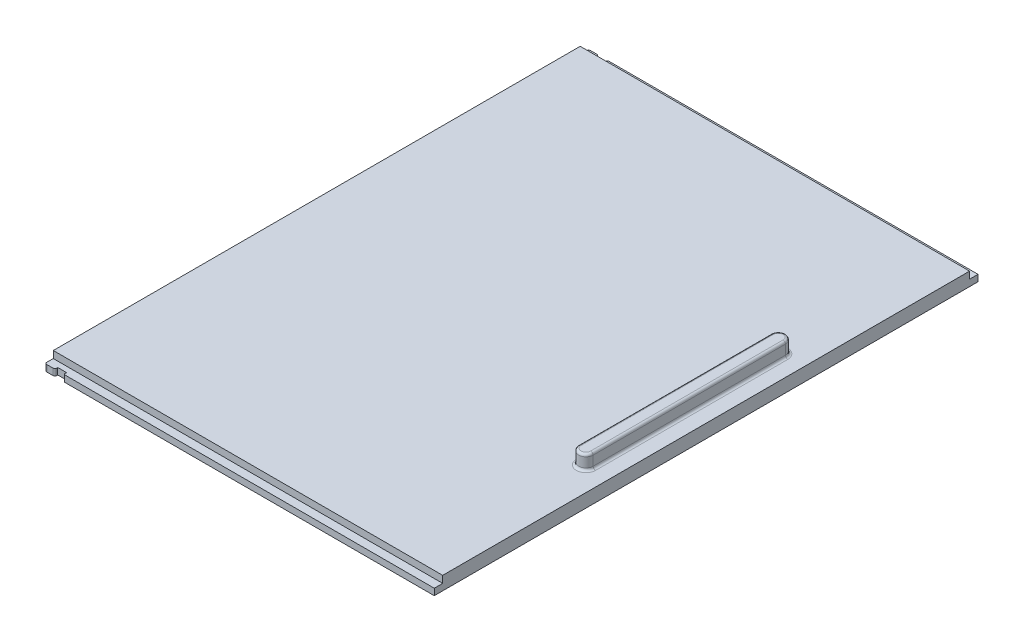
ISO-10303-21;
HEADER;
FILE_DESCRIPTION(('STEP AP214'),'2;1');
FILE_NAME('part.step','',(''),(''),'','','');
FILE_SCHEMA(('AUTOMOTIVE_DESIGN { 1 0 10303 214 1 1 1 1 }'));
ENDSEC;
DATA;
#1=APPLICATION_CONTEXT('core data for automotive mechanical design processes');
#2=APPLICATION_PROTOCOL_DEFINITION('international standard','automotive_design',2000,#1);
#3=PRODUCT_CONTEXT('',#1,'mechanical');
#4=PRODUCT('Part','Part','',(#3));
#5=PRODUCT_RELATED_PRODUCT_CATEGORY('part','',(#4));
#6=PRODUCT_DEFINITION_FORMATION('','',#4);
#7=PRODUCT_DEFINITION_CONTEXT('part definition',#1,'design');
#8=PRODUCT_DEFINITION('design','',#6,#7);
#9=PRODUCT_DEFINITION_SHAPE('','',#8);
#10=(LENGTH_UNIT() NAMED_UNIT(*) SI_UNIT(.MILLI.,.METRE.));
#11=(NAMED_UNIT(*) PLANE_ANGLE_UNIT() SI_UNIT($,.RADIAN.));
#12=(NAMED_UNIT(*) SI_UNIT($,.STERADIAN.) SOLID_ANGLE_UNIT());
#13=UNCERTAINTY_MEASURE_WITH_UNIT(LENGTH_MEASURE(1.E-05),#10,'distance_accuracy_value','');
#14=(GEOMETRIC_REPRESENTATION_CONTEXT(3) GLOBAL_UNCERTAINTY_ASSIGNED_CONTEXT((#13)) GLOBAL_UNIT_ASSIGNED_CONTEXT((#10,
#11,#12)) REPRESENTATION_CONTEXT('',''));
#15=CARTESIAN_POINT('',(0.,0.,0.));
#16=DIRECTION('',(0.,0.,1.));
#17=DIRECTION('',(1.,0.,0.));
#18=AXIS2_PLACEMENT_3D('',#15,#16,#17);
#19=CARTESIAN_POINT('',(0.,3.,0.));
#20=DIRECTION('',(0.,-1.,0.));
#21=DIRECTION('',(0.,0.,-1.));
#22=AXIS2_PLACEMENT_3D('',#19,#20,#21);
#23=PLANE('',#22);
#24=CARTESIAN_POINT('',(76.,3.,-38.));
#25=DIRECTION('',(0.,-1.,0.));
#26=DIRECTION('',(0.,0.,-1.));
#27=AXIS2_PLACEMENT_3D('',#24,#25,#26);
#28=CIRCLE('',#27,2.);
#29=CARTESIAN_POINT('',(78.,3.,-38.));
#30=VERTEX_POINT('',#29);
#31=CARTESIAN_POINT('',(74.,3.,-38.));
#32=VERTEX_POINT('',#31);
#33=EDGE_CURVE('E346',#30,#32,#28,.T.);
#34=ORIENTED_EDGE('',*,*,#33,.T.);
#35=DIRECTION('',(0.,0.,1.));
#36=VECTOR('',#35,1.);
#37=CARTESIAN_POINT('',(74.,3.,-78.));
#38=LINE('',#37,#36);
#39=CARTESIAN_POINT('',(74.,3.,-78.));
#40=VERTEX_POINT('',#39);
#41=EDGE_CURVE('E352',#32,#40,#38,.F.);
#42=ORIENTED_EDGE('',*,*,#41,.T.);
#43=CARTESIAN_POINT('',(76.,3.,-78.));
#44=DIRECTION('',(0.,-1.,0.));
#45=DIRECTION('',(0.,0.,-1.));
#46=AXIS2_PLACEMENT_3D('',#43,#44,#45);
#47=CIRCLE('',#46,2.);
#48=CARTESIAN_POINT('',(78.,3.,-78.));
#49=VERTEX_POINT('',#48);
#50=EDGE_CURVE('E350',#40,#49,#47,.T.);
#51=ORIENTED_EDGE('',*,*,#50,.T.);
#52=DIRECTION('',(0.,0.,-1.));
#53=VECTOR('',#52,1.);
#54=CARTESIAN_POINT('',(78.,3.,-38.));
#55=LINE('',#54,#53);
#56=EDGE_CURVE('E348',#49,#30,#55,.F.);
#57=ORIENTED_EDGE('',*,*,#56,.T.);
#58=EDGE_LOOP('',(#34,#42,#51,#57));
#59=FACE_BOUND('',#58,.T.);
#60=DIRECTION('',(0.,0.,1.));
#61=VECTOR('',#60,1.);
#62=CARTESIAN_POINT('',(0.,3.,0.));
#63=LINE('',#62,#61);
#64=CARTESIAN_POINT('',(0.,3.,-112.8));
#65=VERTEX_POINT('',#64);
#66=CARTESIAN_POINT('',(0.,3.,-3.2));
#67=VERTEX_POINT('',#66);
#68=EDGE_CURVE('E284',#65,#67,#63,.T.);
#69=ORIENTED_EDGE('',*,*,#68,.T.);
#70=DIRECTION('',(1.,0.,0.));
#71=VECTOR('',#70,1.);
#72=CARTESIAN_POINT('',(-3.57805813256298,3.,-3.2));
#73=LINE('',#72,#71);
#74=CARTESIAN_POINT('',(81.,3.,-3.2));
#75=VERTEX_POINT('',#74);
#76=EDGE_CURVE('E469',#67,#75,#73,.T.);
#77=ORIENTED_EDGE('',*,*,#76,.T.);
#78=DIRECTION('',(0.,0.,-1.));
#79=VECTOR('',#78,1.);
#80=CARTESIAN_POINT('',(81.,3.,0.));
#81=LINE('',#80,#79);
#82=CARTESIAN_POINT('',(81.,3.,-112.8));
#83=VERTEX_POINT('',#82);
#84=EDGE_CURVE('E287',#75,#83,#81,.T.);
#85=ORIENTED_EDGE('',*,*,#84,.T.);
#86=DIRECTION('',(1.,0.,0.));
#87=VECTOR('',#86,1.);
#88=CARTESIAN_POINT('',(-3.57805813256298,3.,-112.8));
#89=LINE('',#88,#87);
#90=EDGE_CURVE('E267',#65,#83,#89,.T.);
#91=ORIENTED_EDGE('',*,*,#90,.F.);
#92=EDGE_LOOP('',(#69,#77,#85,#91));
#93=FACE_BOUND('',#92,.T.);
#94=ADVANCED_FACE('F41',(#59,#93),#23,.F.);
#95=CARTESIAN_POINT('',(-3.57805813256298,0.,-114.55));
#96=DIRECTION('',(0.,0.,1.));
#97=DIRECTION('',(1.,0.,0.));
#98=AXIS2_PLACEMENT_3D('',#95,#96,#97);
#99=PLANE('',#98);
#100=DIRECTION('',(1.,0.,0.));
#101=VECTOR('',#100,1.);
#102=CARTESIAN_POINT('',(0.,0.2,-114.55));
#103=LINE('',#102,#101);
#104=CARTESIAN_POINT('',(4.12499999999998,0.2,-114.55));
#105=VERTEX_POINT('',#104);
#106=CARTESIAN_POINT('',(81.,0.2,-114.55));
#107=VERTEX_POINT('',#106);
#108=EDGE_CURVE('E238',#105,#107,#103,.T.);
#109=ORIENTED_EDGE('',*,*,#108,.F.);
#110=DIRECTION('',(0.,1.,0.));
#111=VECTOR('',#110,1.);
#112=CARTESIAN_POINT('',(4.12500000000001,0.,-114.55));
#113=LINE('',#112,#111);
#114=CARTESIAN_POINT('',(4.12500000000001,1.55,-114.55));
#115=VERTEX_POINT('',#114);
#116=EDGE_CURVE('E317',#105,#115,#113,.T.);
#117=ORIENTED_EDGE('',*,*,#116,.T.);
#118=DIRECTION('',(1.,0.,0.));
#119=VECTOR('',#118,1.);
#120=CARTESIAN_POINT('',(-3.57805813256298,1.55,-114.55));
#121=LINE('',#120,#119);
#122=CARTESIAN_POINT('',(81.,1.55,-114.55));
#123=VERTEX_POINT('',#122);
#124=EDGE_CURVE('E264',#115,#123,#121,.T.);
#125=ORIENTED_EDGE('',*,*,#124,.T.);
#126=DIRECTION('',(0.,-1.,0.));
#127=VECTOR('',#126,1.);
#128=CARTESIAN_POINT('',(81.,0.,-114.55));
#129=LINE('',#128,#127);
#130=EDGE_CURVE('E257',#123,#107,#129,.T.);
#131=ORIENTED_EDGE('',*,*,#130,.T.);
#132=EDGE_LOOP('',(#109,#117,#125,#131));
#133=FACE_BOUND('',#132,.T.);
#134=ADVANCED_FACE('F262',(#133),#99,.F.);
#135=CARTESIAN_POINT('',(-3.57805813256298,0.,-1.45));
#136=DIRECTION('',(0.,0.,-1.));
#137=DIRECTION('',(0.,1.,0.));
#138=AXIS2_PLACEMENT_3D('',#135,#136,#137);
#139=PLANE('',#138);
#140=DIRECTION('',(-1.,0.,0.));
#141=VECTOR('',#140,1.);
#142=CARTESIAN_POINT('',(0.,0.2,-1.45));
#143=LINE('',#142,#141);
#144=CARTESIAN_POINT('',(81.,0.2,-1.45));
#145=VERTEX_POINT('',#144);
#146=CARTESIAN_POINT('',(4.12500000000002,0.2,-1.45));
#147=VERTEX_POINT('',#146);
#148=EDGE_CURVE('E416',#145,#147,#143,.T.);
#149=ORIENTED_EDGE('',*,*,#148,.F.);
#150=DIRECTION('',(0.,1.,0.));
#151=VECTOR('',#150,1.);
#152=CARTESIAN_POINT('',(81.,0.,-1.45));
#153=LINE('',#152,#151);
#154=CARTESIAN_POINT('',(81.,1.55,-1.45));
#155=VERTEX_POINT('',#154);
#156=EDGE_CURVE('E259',#145,#155,#153,.T.);
#157=ORIENTED_EDGE('',*,*,#156,.T.);
#158=DIRECTION('',(1.,0.,0.));
#159=VECTOR('',#158,1.);
#160=CARTESIAN_POINT('',(-3.57805813256298,1.55,-1.45));
#161=LINE('',#160,#159);
#162=CARTESIAN_POINT('',(4.12500000000002,1.55,-1.45));
#163=VERTEX_POINT('',#162);
#164=EDGE_CURVE('E477',#163,#155,#161,.T.);
#165=ORIENTED_EDGE('',*,*,#164,.F.);
#166=DIRECTION('',(0.,-1.,0.));
#167=VECTOR('',#166,1.);
#168=CARTESIAN_POINT('',(4.12500000000002,0.,-1.45));
#169=LINE('',#168,#167);
#170=EDGE_CURVE('E303',#163,#147,#169,.T.);
#171=ORIENTED_EDGE('',*,*,#170,.T.);
#172=EDGE_LOOP('',(#149,#157,#165,#171));
#173=FACE_BOUND('',#172,.T.);
#174=ADVANCED_FACE('F568',(#173),#139,.F.);
#175=CARTESIAN_POINT('',(0.,3.,0.));
#176=DIRECTION('',(1.,0.,0.));
#177=DIRECTION('',(0.,0.,-1.));
#178=AXIS2_PLACEMENT_3D('',#175,#176,#177);
#179=PLANE('',#178);
#180=DIRECTION('',(0.,0.,1.));
#181=VECTOR('',#180,1.);
#182=CARTESIAN_POINT('',(0.,1.55,-114.55));
#183=LINE('',#182,#181);
#184=CARTESIAN_POINT('',(0.,1.55,-114.15));
#185=VERTEX_POINT('',#184);
#186=CARTESIAN_POINT('',(0.,1.55,-112.8));
#187=VERTEX_POINT('',#186);
#188=EDGE_CURVE('E279',#185,#187,#183,.T.);
#189=ORIENTED_EDGE('',*,*,#188,.F.);
#190=DIRECTION('',(0.,1.,0.));
#191=VECTOR('',#190,1.);
#192=CARTESIAN_POINT('',(0.,3.,-114.15));
#193=LINE('',#192,#191);
#194=CARTESIAN_POINT('',(0.,0.2,-114.15));
#195=VERTEX_POINT('',#194);
#196=EDGE_CURVE('E329',#185,#195,#193,.F.);
#197=ORIENTED_EDGE('',*,*,#196,.T.);
#198=DIRECTION('',(0.,0.,-1.));
#199=VECTOR('',#198,1.);
#200=CARTESIAN_POINT('',(0.,0.2,-1.45));
#201=LINE('',#200,#199);
#202=CARTESIAN_POINT('',(0.,0.2,-1.85));
#203=VERTEX_POINT('',#202);
#204=EDGE_CURVE('E250',#203,#195,#201,.T.);
#205=ORIENTED_EDGE('',*,*,#204,.F.);
#206=DIRECTION('',(0.,-1.,0.));
#207=VECTOR('',#206,1.);
#208=CARTESIAN_POINT('',(0.,3.,-1.85));
#209=LINE('',#208,#207);
#210=CARTESIAN_POINT('',(0.,1.55,-1.85));
#211=VERTEX_POINT('',#210);
#212=EDGE_CURVE('E327',#203,#211,#209,.F.);
#213=ORIENTED_EDGE('',*,*,#212,.T.);
#214=DIRECTION('',(0.,0.,1.));
#215=VECTOR('',#214,1.);
#216=CARTESIAN_POINT('',(0.,1.55,-1.45));
#217=LINE('',#216,#215);
#218=CARTESIAN_POINT('',(0.,1.55,-3.2));
#219=VERTEX_POINT('',#218);
#220=EDGE_CURVE('E466',#219,#211,#217,.T.);
#221=ORIENTED_EDGE('',*,*,#220,.F.);
#222=DIRECTION('',(0.,-1.,0.));
#223=VECTOR('',#222,1.);
#224=CARTESIAN_POINT('',(0.,1.55,-3.2));
#225=LINE('',#224,#223);
#226=EDGE_CURVE('E288',#67,#219,#225,.T.);
#227=ORIENTED_EDGE('',*,*,#226,.F.);
#228=ORIENTED_EDGE('',*,*,#68,.F.);
#229=DIRECTION('',(0.,1.,0.));
#230=VECTOR('',#229,1.);
#231=CARTESIAN_POINT('',(0.,1.55,-112.8));
#232=LINE('',#231,#230);
#233=EDGE_CURVE('E281',#187,#65,#232,.T.);
#234=ORIENTED_EDGE('',*,*,#233,.F.);
#235=EDGE_LOOP('',(#189,#197,#205,#213,#221,#227,#228,#234));
#236=FACE_BOUND('',#235,.T.);
#237=ADVANCED_FACE('F527',(#236),#179,.F.);
#238=CARTESIAN_POINT('',(81.,3.,0.));
#239=DIRECTION('',(-1.,0.,0.));
#240=DIRECTION('',(0.,0.,1.));
#241=AXIS2_PLACEMENT_3D('',#238,#239,#240);
#242=PLANE('',#241);
#243=DIRECTION('',(0.,0.,1.));
#244=VECTOR('',#243,1.);
#245=CARTESIAN_POINT('',(81.,0.2,-1.45));
#246=LINE('',#245,#244);
#247=EDGE_CURVE('E242',#107,#145,#246,.T.);
#248=ORIENTED_EDGE('',*,*,#247,.F.);
#249=ORIENTED_EDGE('',*,*,#130,.F.);
#250=DIRECTION('',(0.,0.,-1.));
#251=VECTOR('',#250,1.);
#252=CARTESIAN_POINT('',(81.,1.55,-114.55));
#253=LINE('',#252,#251);
#254=CARTESIAN_POINT('',(81.,1.55,-112.8));
#255=VERTEX_POINT('',#254);
#256=EDGE_CURVE('E266',#255,#123,#253,.T.);
#257=ORIENTED_EDGE('',*,*,#256,.F.);
#258=DIRECTION('',(0.,-1.,0.));
#259=VECTOR('',#258,1.);
#260=CARTESIAN_POINT('',(81.,1.55,-112.8));
#261=LINE('',#260,#259);
#262=EDGE_CURVE('E269',#83,#255,#261,.T.);
#263=ORIENTED_EDGE('',*,*,#262,.F.);
#264=ORIENTED_EDGE('',*,*,#84,.F.);
#265=DIRECTION('',(0.,1.,0.));
#266=VECTOR('',#265,1.);
#267=CARTESIAN_POINT('',(81.,1.55,-3.2));
#268=LINE('',#267,#266);
#269=CARTESIAN_POINT('',(81.,1.55,-3.2));
#270=VERTEX_POINT('',#269);
#271=EDGE_CURVE('E475',#270,#75,#268,.T.);
#272=ORIENTED_EDGE('',*,*,#271,.F.);
#273=DIRECTION('',(0.,0.,-1.));
#274=VECTOR('',#273,1.);
#275=CARTESIAN_POINT('',(81.,1.55,-1.45));
#276=LINE('',#275,#274);
#277=EDGE_CURVE('E472',#155,#270,#276,.T.);
#278=ORIENTED_EDGE('',*,*,#277,.F.);
#279=ORIENTED_EDGE('',*,*,#156,.F.);
#280=EDGE_LOOP('',(#248,#249,#257,#263,#264,#272,#278,#279));
#281=FACE_BOUND('',#280,.T.);
#282=ADVANCED_FACE('F255',(#281),#242,.F.);
#283=CARTESIAN_POINT('',(0.4,0.2,-114.55));
#284=VERTEX_POINT('',#283);
#285=CARTESIAN_POINT('',(1.675,0.2,-114.55));
#286=VERTEX_POINT('',#285);
#287=EDGE_CURVE('E249',#284,#286,#103,.T.);
#288=ORIENTED_EDGE('',*,*,#287,.F.);
#289=DIRECTION('',(0.,1.,0.));
#290=VECTOR('',#289,1.);
#291=CARTESIAN_POINT('',(0.4,0.,-114.55));
#292=LINE('',#291,#290);
#293=CARTESIAN_POINT('',(0.4,1.55,-114.55));
#294=VERTEX_POINT('',#293);
#295=EDGE_CURVE('E322',#284,#294,#292,.T.);
#296=ORIENTED_EDGE('',*,*,#295,.T.);
#297=CARTESIAN_POINT('',(1.675,1.55,-114.55));
#298=VERTEX_POINT('',#297);
#299=EDGE_CURVE('E274',#294,#298,#121,.T.);
#300=ORIENTED_EDGE('',*,*,#299,.T.);
#301=DIRECTION('',(0.,1.,0.));
#302=VECTOR('',#301,1.);
#303=CARTESIAN_POINT('',(1.675,0.,-114.55));
#304=LINE('',#303,#302);
#305=EDGE_CURVE('E311',#298,#286,#304,.F.);
#306=ORIENTED_EDGE('',*,*,#305,.T.);
#307=EDGE_LOOP('',(#288,#296,#300,#306));
#308=FACE_BOUND('',#307,.T.);
#309=ADVANCED_FACE('F488',(#308),#99,.F.);
#310=CARTESIAN_POINT('',(0.4,1.55,-1.45));
#311=VERTEX_POINT('',#310);
#312=CARTESIAN_POINT('',(1.675,1.55,-1.45));
#313=VERTEX_POINT('',#312);
#314=EDGE_CURVE('E482',#311,#313,#161,.T.);
#315=ORIENTED_EDGE('',*,*,#314,.F.);
#316=DIRECTION('',(0.,-1.,0.));
#317=VECTOR('',#316,1.);
#318=CARTESIAN_POINT('',(0.4,0.,-1.45));
#319=LINE('',#318,#317);
#320=CARTESIAN_POINT('',(0.4,0.2,-1.45));
#321=VERTEX_POINT('',#320);
#322=EDGE_CURVE('E335',#311,#321,#319,.T.);
#323=ORIENTED_EDGE('',*,*,#322,.T.);
#324=CARTESIAN_POINT('',(1.675,0.2,-1.45));
#325=VERTEX_POINT('',#324);
#326=EDGE_CURVE('E260',#325,#321,#143,.T.);
#327=ORIENTED_EDGE('',*,*,#326,.F.);
#328=DIRECTION('',(0.,-1.,0.));
#329=VECTOR('',#328,1.);
#330=CARTESIAN_POINT('',(1.675,0.,-1.45));
#331=LINE('',#330,#329);
#332=EDGE_CURVE('E294',#325,#313,#331,.F.);
#333=ORIENTED_EDGE('',*,*,#332,.T.);
#334=EDGE_LOOP('',(#315,#323,#327,#333));
#335=FACE_BOUND('',#334,.T.);
#336=ADVANCED_FACE('F541',(#335),#139,.F.);
#337=CARTESIAN_POINT('',(3.925,0.,-2.05));
#338=DIRECTION('',(1.,0.,0.));
#339=DIRECTION('',(0.,0.,-1.));
#340=AXIS2_PLACEMENT_3D('',#337,#338,#339);
#341=PLANE('',#340);
#342=DIRECTION('',(0.,0.,-1.));
#343=VECTOR('',#342,1.);
#344=CARTESIAN_POINT('',(3.925,0.2,-2.05));
#345=LINE('',#344,#343);
#346=CARTESIAN_POINT('',(3.925,0.2,-1.65000000000001));
#347=VERTEX_POINT('',#346);
#348=CARTESIAN_POINT('',(3.925,0.2,-2.05));
#349=VERTEX_POINT('',#348);
#350=EDGE_CURVE('E430',#347,#349,#345,.T.);
#351=ORIENTED_EDGE('',*,*,#350,.F.);
#352=DIRECTION('',(0.,1.,0.));
#353=VECTOR('',#352,1.);
#354=CARTESIAN_POINT('',(3.925,0.,-1.65000000000001));
#355=LINE('',#354,#353);
#356=CARTESIAN_POINT('',(3.925,1.55,-1.65000000000001));
#357=VERTEX_POINT('',#356);
#358=EDGE_CURVE('E299',#347,#357,#355,.T.);
#359=ORIENTED_EDGE('',*,*,#358,.T.);
#360=DIRECTION('',(0.,0.,1.));
#361=VECTOR('',#360,1.);
#362=CARTESIAN_POINT('',(3.925,1.55,-2.05));
#363=LINE('',#362,#361);
#364=CARTESIAN_POINT('',(3.925,1.55,-2.05));
#365=VERTEX_POINT('',#364);
#366=EDGE_CURVE('E461',#365,#357,#363,.T.);
#367=ORIENTED_EDGE('',*,*,#366,.F.);
#368=DIRECTION('',(0.,1.,0.));
#369=VECTOR('',#368,1.);
#370=CARTESIAN_POINT('',(3.925,0.,-2.05));
#371=LINE('',#370,#369);
#372=EDGE_CURVE('E451',#349,#365,#371,.T.);
#373=ORIENTED_EDGE('',*,*,#372,.F.);
#374=EDGE_LOOP('',(#351,#359,#367,#373));
#375=FACE_BOUND('',#374,.T.);
#376=ADVANCED_FACE('F559',(#375),#341,.F.);
#377=CARTESIAN_POINT('',(2.075,0.,-2.05));
#378=DIRECTION('',(-1.,0.,0.));
#379=DIRECTION('',(0.,0.,1.));
#380=AXIS2_PLACEMENT_3D('',#377,#378,#379);
#381=PLANE('',#380);
#382=DIRECTION('',(0.,0.,1.));
#383=VECTOR('',#382,1.);
#384=CARTESIAN_POINT('',(2.075,0.2,-2.05));
#385=LINE('',#384,#383);
#386=CARTESIAN_POINT('',(2.075,0.2,-2.05));
#387=VERTEX_POINT('',#386);
#388=CARTESIAN_POINT('',(2.075,0.2,-1.85));
#389=VERTEX_POINT('',#388);
#390=EDGE_CURVE('E434',#387,#389,#385,.T.);
#391=ORIENTED_EDGE('',*,*,#390,.F.);
#392=DIRECTION('',(0.,-1.,0.));
#393=VECTOR('',#392,1.);
#394=CARTESIAN_POINT('',(2.075,0.,-2.05));
#395=LINE('',#394,#393);
#396=CARTESIAN_POINT('',(2.075,1.55,-2.05));
#397=VERTEX_POINT('',#396);
#398=EDGE_CURVE('E458',#397,#387,#395,.T.);
#399=ORIENTED_EDGE('',*,*,#398,.F.);
#400=DIRECTION('',(0.,0.,1.));
#401=VECTOR('',#400,1.);
#402=CARTESIAN_POINT('',(2.075,1.55,-2.05));
#403=LINE('',#402,#401);
#404=CARTESIAN_POINT('',(2.075,1.55,-1.85));
#405=VERTEX_POINT('',#404);
#406=EDGE_CURVE('E282',#397,#405,#403,.T.);
#407=ORIENTED_EDGE('',*,*,#406,.T.);
#408=DIRECTION('',(0.,-1.,0.));
#409=VECTOR('',#408,1.);
#410=CARTESIAN_POINT('',(2.075,0.,-1.85));
#411=LINE('',#410,#409);
#412=EDGE_CURVE('E291',#405,#389,#411,.T.);
#413=ORIENTED_EDGE('',*,*,#412,.T.);
#414=EDGE_LOOP('',(#391,#399,#407,#413));
#415=FACE_BOUND('',#414,.T.);
#416=ADVANCED_FACE('F549',(#415),#381,.F.);
#417=CARTESIAN_POINT('',(0.,0.,-2.05));
#418=DIRECTION('',(0.,0.,-1.));
#419=DIRECTION('',(-1.,0.,0.));
#420=AXIS2_PLACEMENT_3D('',#417,#418,#419);
#421=PLANE('',#420);
#422=DIRECTION('',(-1.,0.,0.));
#423=VECTOR('',#422,1.);
#424=CARTESIAN_POINT('',(0.,0.2,-2.05));
#425=LINE('',#424,#423);
#426=EDGE_CURVE('E432',#349,#387,#425,.T.);
#427=ORIENTED_EDGE('',*,*,#426,.F.);
#428=ORIENTED_EDGE('',*,*,#372,.T.);
#429=DIRECTION('',(-1.,0.,0.));
#430=VECTOR('',#429,1.);
#431=CARTESIAN_POINT('',(2.075,1.55,-2.05));
#432=LINE('',#431,#430);
#433=EDGE_CURVE('E455',#365,#397,#432,.T.);
#434=ORIENTED_EDGE('',*,*,#433,.T.);
#435=ORIENTED_EDGE('',*,*,#398,.T.);
#436=EDGE_LOOP('',(#427,#428,#434,#435));
#437=FACE_BOUND('',#436,.T.);
#438=ADVANCED_FACE('F555',(#437),#421,.F.);
#439=CARTESIAN_POINT('',(1.675,0.,-1.85));
#440=DIRECTION('',(0.,-1.,0.));
#441=DIRECTION('',(0.,0.,-1.));
#442=AXIS2_PLACEMENT_3D('',#439,#440,#441);
#443=CYLINDRICAL_SURFACE('',#442,0.4);
#444=ORIENTED_EDGE('',*,*,#332,.F.);
#445=CARTESIAN_POINT('',(1.675,0.2,-1.85));
#446=DIRECTION('',(0.,-1.,0.));
#447=DIRECTION('',(0.,0.,-1.));
#448=AXIS2_PLACEMENT_3D('',#445,#446,#447);
#449=CIRCLE('',#448,0.4);
#450=EDGE_CURVE('E436',#325,#389,#449,.F.);
#451=ORIENTED_EDGE('',*,*,#450,.T.);
#452=ORIENTED_EDGE('',*,*,#412,.F.);
#453=CARTESIAN_POINT('',(1.675,1.55,-1.85));
#454=DIRECTION('',(0.,-1.,0.));
#455=DIRECTION('',(0.,0.,-1.));
#456=AXIS2_PLACEMENT_3D('',#453,#454,#455);
#457=CIRCLE('',#456,0.4);
#458=EDGE_CURVE('E297',#313,#405,#457,.F.);
#459=ORIENTED_EDGE('',*,*,#458,.F.);
#460=EDGE_LOOP('',(#444,#451,#452,#459));
#461=FACE_BOUND('',#460,.T.);
#462=ADVANCED_FACE('F546',(#461),#443,.T.);
#463=CARTESIAN_POINT('',(3.925,0.,-1.65000000000001));
#464=DIRECTION('',(0.707106781186523,0.,-0.707106781186572));
#465=DIRECTION('',(0.,1.,0.));
#466=AXIS2_PLACEMENT_3D('',#463,#464,#465);
#467=PLANE('',#466);
#468=ORIENTED_EDGE('',*,*,#358,.F.);
#469=DIRECTION('',(-0.707106781186572,0.,-0.707106781186523));
#470=VECTOR('',#469,1.);
#471=CARTESIAN_POINT('',(3.925,0.2,-1.65000000000001));
#472=LINE('',#471,#470);
#473=EDGE_CURVE('E427',#347,#147,#472,.F.);
#474=ORIENTED_EDGE('',*,*,#473,.T.);
#475=ORIENTED_EDGE('',*,*,#170,.F.);
#476=DIRECTION('',(-0.707106781186572,0.,-0.707106781186523));
#477=VECTOR('',#476,1.);
#478=CARTESIAN_POINT('',(3.925,1.55,-1.65000000000001));
#479=LINE('',#478,#477);
#480=EDGE_CURVE('E301',#357,#163,#479,.F.);
#481=ORIENTED_EDGE('',*,*,#480,.F.);
#482=EDGE_LOOP('',(#468,#474,#475,#481));
#483=FACE_BOUND('',#482,.T.);
#484=ADVANCED_FACE('F564',(#483),#467,.F.);
#485=CARTESIAN_POINT('',(3.925,1.55,-113.95));
#486=DIRECTION('',(1.,0.,0.));
#487=DIRECTION('',(0.,0.,-1.));
#488=AXIS2_PLACEMENT_3D('',#485,#486,#487);
#489=PLANE('',#488);
#490=DIRECTION('',(0.,0.,-1.));
#491=VECTOR('',#490,1.);
#492=CARTESIAN_POINT('',(3.925,0.2,-113.95));
#493=LINE('',#492,#491);
#494=CARTESIAN_POINT('',(3.925,0.2,-113.95));
#495=VERTEX_POINT('',#494);
#496=CARTESIAN_POINT('',(3.925,0.2,-114.35));
#497=VERTEX_POINT('',#496);
#498=EDGE_CURVE('E418',#495,#497,#493,.T.);
#499=ORIENTED_EDGE('',*,*,#498,.F.);
#500=DIRECTION('',(0.,-1.,0.));
#501=VECTOR('',#500,1.);
#502=CARTESIAN_POINT('',(3.925,1.55,-113.95));
#503=LINE('',#502,#501);
#504=CARTESIAN_POINT('',(3.925,1.55,-113.95));
#505=VERTEX_POINT('',#504);
#506=EDGE_CURVE('E439',#505,#495,#503,.T.);
#507=ORIENTED_EDGE('',*,*,#506,.F.);
#508=DIRECTION('',(0.,0.,-1.));
#509=VECTOR('',#508,1.);
#510=CARTESIAN_POINT('',(3.925,1.55,-113.95));
#511=LINE('',#510,#509);
#512=CARTESIAN_POINT('',(3.925,1.55,-114.35));
#513=VERTEX_POINT('',#512);
#514=EDGE_CURVE('E448',#505,#513,#511,.T.);
#515=ORIENTED_EDGE('',*,*,#514,.T.);
#516=DIRECTION('',(0.,-1.,0.));
#517=VECTOR('',#516,1.);
#518=CARTESIAN_POINT('',(3.925,1.55,-114.35));
#519=LINE('',#518,#517);
#520=EDGE_CURVE('E314',#513,#497,#519,.T.);
#521=ORIENTED_EDGE('',*,*,#520,.T.);
#522=EDGE_LOOP('',(#499,#507,#515,#521));
#523=FACE_BOUND('',#522,.T.);
#524=ADVANCED_FACE('F508',(#523),#489,.F.);
#525=CARTESIAN_POINT('',(2.075,1.55,-113.95));
#526=DIRECTION('',(-1.,0.,0.));
#527=DIRECTION('',(0.,0.,1.));
#528=AXIS2_PLACEMENT_3D('',#525,#526,#527);
#529=PLANE('',#528);
#530=DIRECTION('',(0.,0.,1.));
#531=VECTOR('',#530,1.);
#532=CARTESIAN_POINT('',(2.075,0.2,-113.95));
#533=LINE('',#532,#531);
#534=CARTESIAN_POINT('',(2.075,0.2,-114.15));
#535=VERTEX_POINT('',#534);
#536=CARTESIAN_POINT('',(2.075,0.2,-113.95));
#537=VERTEX_POINT('',#536);
#538=EDGE_CURVE('E422',#535,#537,#533,.T.);
#539=ORIENTED_EDGE('',*,*,#538,.F.);
#540=DIRECTION('',(0.,1.,0.));
#541=VECTOR('',#540,1.);
#542=CARTESIAN_POINT('',(2.075,1.55,-114.15));
#543=LINE('',#542,#541);
#544=CARTESIAN_POINT('',(2.075,1.55,-114.15));
#545=VERTEX_POINT('',#544);
#546=EDGE_CURVE('E306',#535,#545,#543,.T.);
#547=ORIENTED_EDGE('',*,*,#546,.T.);
#548=DIRECTION('',(0.,0.,-1.));
#549=VECTOR('',#548,1.);
#550=CARTESIAN_POINT('',(2.075,1.55,-113.95));
#551=LINE('',#550,#549);
#552=CARTESIAN_POINT('',(2.075,1.55,-113.95));
#553=VERTEX_POINT('',#552);
#554=EDGE_CURVE('E447',#553,#545,#551,.T.);
#555=ORIENTED_EDGE('',*,*,#554,.F.);
#556=DIRECTION('',(0.,1.,0.));
#557=VECTOR('',#556,1.);
#558=CARTESIAN_POINT('',(2.075,1.55,-113.95));
#559=LINE('',#558,#557);
#560=EDGE_CURVE('E442',#537,#553,#559,.T.);
#561=ORIENTED_EDGE('',*,*,#560,.F.);
#562=EDGE_LOOP('',(#539,#547,#555,#561));
#563=FACE_BOUND('',#562,.T.);
#564=ADVANCED_FACE('F502',(#563),#529,.F.);
#565=CARTESIAN_POINT('',(0.,0.,-113.95));
#566=DIRECTION('',(0.,0.,1.));
#567=DIRECTION('',(1.,0.,0.));
#568=AXIS2_PLACEMENT_3D('',#565,#566,#567);
#569=PLANE('',#568);
#570=DIRECTION('',(1.,0.,0.));
#571=VECTOR('',#570,1.);
#572=CARTESIAN_POINT('',(0.,0.2,-113.95));
#573=LINE('',#572,#571);
#574=EDGE_CURVE('E420',#537,#495,#573,.T.);
#575=ORIENTED_EDGE('',*,*,#574,.F.);
#576=ORIENTED_EDGE('',*,*,#560,.T.);
#577=DIRECTION('',(1.,0.,0.));
#578=VECTOR('',#577,1.);
#579=CARTESIAN_POINT('',(2.075,1.55,-113.95));
#580=LINE('',#579,#578);
#581=EDGE_CURVE('E444',#553,#505,#580,.T.);
#582=ORIENTED_EDGE('',*,*,#581,.T.);
#583=ORIENTED_EDGE('',*,*,#506,.T.);
#584=EDGE_LOOP('',(#575,#576,#582,#583));
#585=FACE_BOUND('',#584,.T.);
#586=ADVANCED_FACE('F504',(#585),#569,.F.);
#587=CARTESIAN_POINT('',(1.675,1.55,-114.15));
#588=DIRECTION('',(0.,1.,0.));
#589=DIRECTION('',(0.,0.,1.));
#590=AXIS2_PLACEMENT_3D('',#587,#588,#589);
#591=CYLINDRICAL_SURFACE('',#590,0.4);
#592=ORIENTED_EDGE('',*,*,#546,.F.);
#593=CARTESIAN_POINT('',(1.675,0.2,-114.15));
#594=DIRECTION('',(0.,-1.,0.));
#595=DIRECTION('',(0.,0.,-1.));
#596=AXIS2_PLACEMENT_3D('',#593,#594,#595);
#597=CIRCLE('',#596,0.4);
#598=EDGE_CURVE('E424',#535,#286,#597,.F.);
#599=ORIENTED_EDGE('',*,*,#598,.T.);
#600=ORIENTED_EDGE('',*,*,#305,.F.);
#601=CARTESIAN_POINT('',(1.675,1.55,-114.15));
#602=DIRECTION('',(0.,-1.,0.));
#603=DIRECTION('',(0.,0.,-1.));
#604=AXIS2_PLACEMENT_3D('',#601,#602,#603);
#605=CIRCLE('',#604,0.4);
#606=EDGE_CURVE('E308',#545,#298,#605,.F.);
#607=ORIENTED_EDGE('',*,*,#606,.F.);
#608=EDGE_LOOP('',(#592,#599,#600,#607));
#609=FACE_BOUND('',#608,.T.);
#610=ADVANCED_FACE('F497',(#609),#591,.T.);
#611=CARTESIAN_POINT('',(3.925,1.55,-114.35));
#612=DIRECTION('',(0.707106781186572,0.,0.707106781186523));
#613=DIRECTION('',(0.,-1.,0.));
#614=AXIS2_PLACEMENT_3D('',#611,#612,#613);
#615=PLANE('',#614);
#616=ORIENTED_EDGE('',*,*,#116,.F.);
#617=DIRECTION('',(0.707106781186523,0.,-0.707106781186572));
#618=VECTOR('',#617,1.);
#619=CARTESIAN_POINT('',(3.925,0.2,-114.35));
#620=LINE('',#619,#618);
#621=EDGE_CURVE('E245',#105,#497,#620,.F.);
#622=ORIENTED_EDGE('',*,*,#621,.T.);
#623=ORIENTED_EDGE('',*,*,#520,.F.);
#624=DIRECTION('',(0.707106781186523,0.,-0.707106781186572));
#625=VECTOR('',#624,1.);
#626=CARTESIAN_POINT('',(3.925,1.55,-114.35));
#627=LINE('',#626,#625);
#628=EDGE_CURVE('E319',#115,#513,#627,.F.);
#629=ORIENTED_EDGE('',*,*,#628,.F.);
#630=EDGE_LOOP('',(#616,#622,#623,#629));
#631=FACE_BOUND('',#630,.T.);
#632=ADVANCED_FACE('F512',(#631),#615,.F.);
#633=CARTESIAN_POINT('',(-3.57805813256298,1.55,-114.55));
#634=DIRECTION('',(0.,-1.,0.));
#635=DIRECTION('',(0.,0.,-1.));
#636=AXIS2_PLACEMENT_3D('',#633,#634,#635);
#637=PLANE('',#636);
#638=ORIENTED_EDGE('',*,*,#299,.F.);
#639=CARTESIAN_POINT('',(0.4,1.55,-114.15));
#640=DIRECTION('',(0.,-1.,0.));
#641=DIRECTION('',(0.,0.,-1.));
#642=AXIS2_PLACEMENT_3D('',#639,#640,#641);
#643=CIRCLE('',#642,0.4);
#644=EDGE_CURVE('E325',#294,#185,#643,.F.);
#645=ORIENTED_EDGE('',*,*,#644,.T.);
#646=ORIENTED_EDGE('',*,*,#188,.T.);
#647=DIRECTION('',(1.,0.,0.));
#648=VECTOR('',#647,1.);
#649=CARTESIAN_POINT('',(-3.57805813256298,1.55,-112.8));
#650=LINE('',#649,#648);
#651=EDGE_CURVE('E271',#187,#255,#650,.T.);
#652=ORIENTED_EDGE('',*,*,#651,.T.);
#653=ORIENTED_EDGE('',*,*,#256,.T.);
#654=ORIENTED_EDGE('',*,*,#124,.F.);
#655=ORIENTED_EDGE('',*,*,#628,.T.);
#656=ORIENTED_EDGE('',*,*,#514,.F.);
#657=ORIENTED_EDGE('',*,*,#581,.F.);
#658=ORIENTED_EDGE('',*,*,#554,.T.);
#659=ORIENTED_EDGE('',*,*,#606,.T.);
#660=EDGE_LOOP('',(#638,#645,#646,#652,#653,#654,#655,#656,#657,#658,#659));
#661=FACE_BOUND('',#660,.T.);
#662=ADVANCED_FACE('F492',(#661),#637,.F.);
#663=CARTESIAN_POINT('',(-3.57805813256298,1.55,-112.8));
#664=DIRECTION('',(0.,0.,1.));
#665=DIRECTION('',(1.,0.,0.));
#666=AXIS2_PLACEMENT_3D('',#663,#664,#665);
#667=PLANE('',#666);
#668=ORIENTED_EDGE('',*,*,#233,.T.);
#669=ORIENTED_EDGE('',*,*,#90,.T.);
#670=ORIENTED_EDGE('',*,*,#262,.T.);
#671=ORIENTED_EDGE('',*,*,#651,.F.);
#672=EDGE_LOOP('',(#668,#669,#670,#671));
#673=FACE_BOUND('',#672,.T.);
#674=ADVANCED_FACE('F832',(#673),#667,.F.);
#675=CARTESIAN_POINT('',(-3.57805813256298,1.55,-3.2));
#676=DIRECTION('',(0.,0.,-1.));
#677=DIRECTION('',(-1.,0.,0.));
#678=AXIS2_PLACEMENT_3D('',#675,#676,#677);
#679=PLANE('',#678);
#680=ORIENTED_EDGE('',*,*,#226,.T.);
#681=DIRECTION('',(1.,0.,0.));
#682=VECTOR('',#681,1.);
#683=CARTESIAN_POINT('',(-3.57805813256298,1.55,-3.2));
#684=LINE('',#683,#682);
#685=EDGE_CURVE('E480',#219,#270,#684,.T.);
#686=ORIENTED_EDGE('',*,*,#685,.T.);
#687=ORIENTED_EDGE('',*,*,#271,.T.);
#688=ORIENTED_EDGE('',*,*,#76,.F.);
#689=EDGE_LOOP('',(#680,#686,#687,#688));
#690=FACE_BOUND('',#689,.T.);
#691=ADVANCED_FACE('F522',(#690),#679,.F.);
#692=CARTESIAN_POINT('',(-3.57805813256298,1.55,-1.45));
#693=DIRECTION('',(0.,-1.,0.));
#694=DIRECTION('',(0.,0.,-1.));
#695=AXIS2_PLACEMENT_3D('',#692,#693,#694);
#696=PLANE('',#695);
#697=ORIENTED_EDGE('',*,*,#220,.T.);
#698=CARTESIAN_POINT('',(0.4,1.55,-1.85));
#699=DIRECTION('',(0.,-1.,0.));
#700=DIRECTION('',(0.,0.,-1.));
#701=AXIS2_PLACEMENT_3D('',#698,#699,#700);
#702=CIRCLE('',#701,0.4);
#703=EDGE_CURVE('E338',#211,#311,#702,.F.);
#704=ORIENTED_EDGE('',*,*,#703,.T.);
#705=ORIENTED_EDGE('',*,*,#314,.T.);
#706=ORIENTED_EDGE('',*,*,#458,.T.);
#707=ORIENTED_EDGE('',*,*,#406,.F.);
#708=ORIENTED_EDGE('',*,*,#433,.F.);
#709=ORIENTED_EDGE('',*,*,#366,.T.);
#710=ORIENTED_EDGE('',*,*,#480,.T.);
#711=ORIENTED_EDGE('',*,*,#164,.T.);
#712=ORIENTED_EDGE('',*,*,#277,.T.);
#713=ORIENTED_EDGE('',*,*,#685,.F.);
#714=EDGE_LOOP('',(#697,#704,#705,#706,#707,#708,#709,#710,#711,#712,#713));
#715=FACE_BOUND('',#714,.T.);
#716=ADVANCED_FACE('F533',(#715),#696,.F.);
#717=CARTESIAN_POINT('',(0.,0.2,0.));
#718=DIRECTION('',(0.,-1.,0.));
#719=DIRECTION('',(0.,0.,-1.));
#720=AXIS2_PLACEMENT_3D('',#717,#718,#719);
#721=PLANE('',#720);
#722=ORIENTED_EDGE('',*,*,#204,.T.);
#723=CARTESIAN_POINT('',(0.4,0.2,-114.15));
#724=DIRECTION('',(0.,-1.,0.));
#725=DIRECTION('',(0.,0.,-1.));
#726=AXIS2_PLACEMENT_3D('',#723,#724,#725);
#727=CIRCLE('',#726,0.4);
#728=EDGE_CURVE('E333',#195,#284,#727,.T.);
#729=ORIENTED_EDGE('',*,*,#728,.T.);
#730=ORIENTED_EDGE('',*,*,#287,.T.);
#731=ORIENTED_EDGE('',*,*,#598,.F.);
#732=ORIENTED_EDGE('',*,*,#538,.T.);
#733=ORIENTED_EDGE('',*,*,#574,.T.);
#734=ORIENTED_EDGE('',*,*,#498,.T.);
#735=ORIENTED_EDGE('',*,*,#621,.F.);
#736=ORIENTED_EDGE('',*,*,#108,.T.);
#737=ORIENTED_EDGE('',*,*,#247,.T.);
#738=ORIENTED_EDGE('',*,*,#148,.T.);
#739=ORIENTED_EDGE('',*,*,#473,.F.);
#740=ORIENTED_EDGE('',*,*,#350,.T.);
#741=ORIENTED_EDGE('',*,*,#426,.T.);
#742=ORIENTED_EDGE('',*,*,#390,.T.);
#743=ORIENTED_EDGE('',*,*,#450,.F.);
#744=ORIENTED_EDGE('',*,*,#326,.T.);
#745=CARTESIAN_POINT('',(0.4,0.2,-1.85));
#746=DIRECTION('',(0.,-1.,0.));
#747=DIRECTION('',(0.,0.,-1.));
#748=AXIS2_PLACEMENT_3D('',#745,#746,#747);
#749=CIRCLE('',#748,0.4);
#750=EDGE_CURVE('E331',#321,#203,#749,.T.);
#751=ORIENTED_EDGE('',*,*,#750,.T.);
#752=EDGE_LOOP('',(#722,#729,#730,#731,#732,#733,#734,#735,#736,#737,#738,#739,#740,#741,#742,
#743,#744,#751));
#753=FACE_BOUND('',#752,.T.);
#754=ADVANCED_FACE('F241',(#753),#721,.T.);
#755=CARTESIAN_POINT('',(0.4,0.,-114.15));
#756=DIRECTION('',(0.,1.,0.));
#757=DIRECTION('',(0.,0.,1.));
#758=AXIS2_PLACEMENT_3D('',#755,#756,#757);
#759=CYLINDRICAL_SURFACE('',#758,0.4);
#760=ORIENTED_EDGE('',*,*,#728,.F.);
#761=ORIENTED_EDGE('',*,*,#196,.F.);
#762=ORIENTED_EDGE('',*,*,#644,.F.);
#763=ORIENTED_EDGE('',*,*,#295,.F.);
#764=EDGE_LOOP('',(#760,#761,#762,#763));
#765=FACE_BOUND('',#764,.T.);
#766=ADVANCED_FACE('F605',(#765),#759,.T.);
#767=CARTESIAN_POINT('',(0.4,0.,-1.85));
#768=DIRECTION('',(0.,-1.,0.));
#769=DIRECTION('',(0.,0.,-1.));
#770=AXIS2_PLACEMENT_3D('',#767,#768,#769);
#771=CYLINDRICAL_SURFACE('',#770,0.4);
#772=ORIENTED_EDGE('',*,*,#703,.F.);
#773=ORIENTED_EDGE('',*,*,#212,.F.);
#774=ORIENTED_EDGE('',*,*,#750,.F.);
#775=ORIENTED_EDGE('',*,*,#322,.F.);
#776=EDGE_LOOP('',(#772,#773,#774,#775));
#777=FACE_BOUND('',#776,.T.);
#778=ADVANCED_FACE('F537',(#777),#771,.T.);
#779=CARTESIAN_POINT('',(76.,6.,-38.));
#780=DIRECTION('',(0.,-1.,0.));
#781=DIRECTION('',(0.,0.,-1.));
#782=AXIS2_PLACEMENT_3D('',#779,#780,#781);
#783=CYLINDRICAL_SURFACE('',#782,1.5);
#784=DIRECTION('',(0.,-1.,0.));
#785=VECTOR('',#784,1.);
#786=CARTESIAN_POINT('',(77.5,6.,-38.));
#787=LINE('',#786,#785);
#788=CARTESIAN_POINT('',(77.5,5.5,-38.));
#789=VERTEX_POINT('',#788);
#790=CARTESIAN_POINT('',(77.5,3.5,-38.));
#791=VERTEX_POINT('',#790);
#792=EDGE_CURVE('E401',#789,#791,#787,.T.);
#793=ORIENTED_EDGE('',*,*,#792,.F.);
#794=CARTESIAN_POINT('',(76.,5.5,-38.));
#795=DIRECTION('',(0.,1.,0.));
#796=DIRECTION('',(0.,0.,1.));
#797=AXIS2_PLACEMENT_3D('',#794,#795,#796);
#798=CIRCLE('',#797,1.5);
#799=CARTESIAN_POINT('',(74.5,5.5,-38.));
#800=VERTEX_POINT('',#799);
#801=EDGE_CURVE('E11',#789,#800,#798,.F.);
#802=ORIENTED_EDGE('',*,*,#801,.T.);
#803=DIRECTION('',(0.,-1.,0.));
#804=VECTOR('',#803,1.);
#805=CARTESIAN_POINT('',(74.5,6.,-38.));
#806=LINE('',#805,#804);
#807=CARTESIAN_POINT('',(74.5,3.5,-38.));
#808=VERTEX_POINT('',#807);
#809=EDGE_CURVE('E380',#800,#808,#806,.T.);
#810=ORIENTED_EDGE('',*,*,#809,.T.);
#811=CARTESIAN_POINT('',(76.,3.5,-38.));
#812=DIRECTION('',(0.,-1.,0.));
#813=DIRECTION('',(0.,0.,-1.));
#814=AXIS2_PLACEMENT_3D('',#811,#812,#813);
#815=CIRCLE('',#814,1.5);
#816=EDGE_CURVE('E50',#808,#791,#815,.F.);
#817=ORIENTED_EDGE('',*,*,#816,.T.);
#818=EDGE_LOOP('',(#793,#802,#810,#817));
#819=FACE_BOUND('',#818,.T.);
#820=ADVANCED_FACE('F406',(#819),#783,.T.);
#821=CARTESIAN_POINT('',(77.5,6.,-38.));
#822=DIRECTION('',(-1.,0.,0.));
#823=DIRECTION('',(0.,0.,1.));
#824=AXIS2_PLACEMENT_3D('',#821,#822,#823);
#825=PLANE('',#824);
#826=ORIENTED_EDGE('',*,*,#792,.T.);
#827=DIRECTION('',(0.,0.,-1.));
#828=VECTOR('',#827,1.);
#829=CARTESIAN_POINT('',(77.5,3.5,-78.));
#830=LINE('',#829,#828);
#831=CARTESIAN_POINT('',(77.5,3.5,-78.));
#832=VERTEX_POINT('',#831);
#833=EDGE_CURVE('E361',#791,#832,#830,.T.);
#834=ORIENTED_EDGE('',*,*,#833,.T.);
#835=DIRECTION('',(0.,-1.,0.));
#836=VECTOR('',#835,1.);
#837=CARTESIAN_POINT('',(77.5,6.,-78.));
#838=LINE('',#837,#836);
#839=CARTESIAN_POINT('',(77.5,5.5,-78.));
#840=VERTEX_POINT('',#839);
#841=EDGE_CURVE('E404',#840,#832,#838,.T.);
#842=ORIENTED_EDGE('',*,*,#841,.F.);
#843=DIRECTION('',(0.,0.,-1.));
#844=VECTOR('',#843,1.);
#845=CARTESIAN_POINT('',(77.5,5.5,-38.));
#846=LINE('',#845,#844);
#847=EDGE_CURVE('E359',#840,#789,#846,.F.);
#848=ORIENTED_EDGE('',*,*,#847,.T.);
#849=EDGE_LOOP('',(#826,#834,#842,#848));
#850=FACE_BOUND('',#849,.T.);
#851=ADVANCED_FACE('F400',(#850),#825,.F.);
#852=CARTESIAN_POINT('',(76.,6.,-78.));
#853=DIRECTION('',(0.,-1.,0.));
#854=DIRECTION('',(0.,0.,-1.));
#855=AXIS2_PLACEMENT_3D('',#852,#853,#854);
#856=CYLINDRICAL_SURFACE('',#855,1.5);
#857=ORIENTED_EDGE('',*,*,#841,.T.);
#858=CARTESIAN_POINT('',(76.,3.5,-78.));
#859=DIRECTION('',(0.,-1.,0.));
#860=DIRECTION('',(0.,0.,-1.));
#861=AXIS2_PLACEMENT_3D('',#858,#859,#860);
#862=CIRCLE('',#861,1.5);
#863=CARTESIAN_POINT('',(74.5,3.5,-78.));
#864=VERTEX_POINT('',#863);
#865=EDGE_CURVE('E357',#832,#864,#862,.F.);
#866=ORIENTED_EDGE('',*,*,#865,.T.);
#867=DIRECTION('',(0.,-1.,0.));
#868=VECTOR('',#867,1.);
#869=CARTESIAN_POINT('',(74.5,6.,-78.));
#870=LINE('',#869,#868);
#871=CARTESIAN_POINT('',(74.5,5.5,-78.));
#872=VERTEX_POINT('',#871);
#873=EDGE_CURVE('E412',#872,#864,#870,.T.);
#874=ORIENTED_EDGE('',*,*,#873,.F.);
#875=CARTESIAN_POINT('',(76.,5.5,-78.));
#876=DIRECTION('',(0.,1.,0.));
#877=DIRECTION('',(0.,0.,1.));
#878=AXIS2_PLACEMENT_3D('',#875,#876,#877);
#879=CIRCLE('',#878,1.5);
#880=EDGE_CURVE('E355',#872,#840,#879,.F.);
#881=ORIENTED_EDGE('',*,*,#880,.T.);
#882=EDGE_LOOP('',(#857,#866,#874,#881));
#883=FACE_BOUND('',#882,.T.);
#884=ADVANCED_FACE('F674',(#883),#856,.T.);
#885=CARTESIAN_POINT('',(74.5,6.,-38.));
#886=DIRECTION('',(1.,0.,0.));
#887=DIRECTION('',(0.,0.,-1.));
#888=AXIS2_PLACEMENT_3D('',#885,#886,#887);
#889=PLANE('',#888);
#890=ORIENTED_EDGE('',*,*,#873,.T.);
#891=DIRECTION('',(0.,0.,1.));
#892=VECTOR('',#891,1.);
#893=CARTESIAN_POINT('',(74.5,3.5,-38.));
#894=LINE('',#893,#892);
#895=EDGE_CURVE('E343',#864,#808,#894,.T.);
#896=ORIENTED_EDGE('',*,*,#895,.T.);
#897=ORIENTED_EDGE('',*,*,#809,.F.);
#898=DIRECTION('',(0.,0.,1.));
#899=VECTOR('',#898,1.);
#900=CARTESIAN_POINT('',(74.5,5.5,-78.));
#901=LINE('',#900,#899);
#902=EDGE_CURVE('E340',#800,#872,#901,.F.);
#903=ORIENTED_EDGE('',*,*,#902,.T.);
#904=EDGE_LOOP('',(#890,#896,#897,#903));
#905=FACE_BOUND('',#904,.T.);
#906=ADVANCED_FACE('F666',(#905),#889,.F.);
#907=CARTESIAN_POINT('',(76.,6.,-38.));
#908=DIRECTION('',(0.,1.,0.));
#909=DIRECTION('',(0.,0.,1.));
#910=AXIS2_PLACEMENT_3D('',#907,#908,#909);
#911=PLANE('',#910);
#912=CARTESIAN_POINT('',(76.,6.,-78.));
#913=DIRECTION('',(0.,1.,0.));
#914=DIRECTION('',(0.,0.,1.));
#915=AXIS2_PLACEMENT_3D('',#912,#913,#914);
#916=CIRCLE('',#915,1.);
#917=CARTESIAN_POINT('',(77.,6.,-78.));
#918=VERTEX_POINT('',#917);
#919=CARTESIAN_POINT('',(75.,6.,-78.));
#920=VERTEX_POINT('',#919);
#921=EDGE_CURVE('E58',#918,#920,#916,.T.);
#922=ORIENTED_EDGE('',*,*,#921,.T.);
#923=DIRECTION('',(0.,0.,1.));
#924=VECTOR('',#923,1.);
#925=CARTESIAN_POINT('',(75.,6.,-38.));
#926=LINE('',#925,#924);
#927=CARTESIAN_POINT('',(75.,6.,-38.));
#928=VERTEX_POINT('',#927);
#929=EDGE_CURVE('E367',#920,#928,#926,.T.);
#930=ORIENTED_EDGE('',*,*,#929,.T.);
#931=CARTESIAN_POINT('',(76.,6.,-38.));
#932=DIRECTION('',(0.,1.,0.));
#933=DIRECTION('',(0.,0.,1.));
#934=AXIS2_PLACEMENT_3D('',#931,#932,#933);
#935=CIRCLE('',#934,1.);
#936=CARTESIAN_POINT('',(77.,6.,-38.));
#937=VERTEX_POINT('',#936);
#938=EDGE_CURVE('E363',#928,#937,#935,.T.);
#939=ORIENTED_EDGE('',*,*,#938,.T.);
#940=DIRECTION('',(0.,0.,-1.));
#941=VECTOR('',#940,1.);
#942=CARTESIAN_POINT('',(77.,6.,-78.));
#943=LINE('',#942,#941);
#944=EDGE_CURVE('E63',#937,#918,#943,.T.);
#945=ORIENTED_EDGE('',*,*,#944,.T.);
#946=EDGE_LOOP('',(#922,#930,#939,#945));
#947=FACE_BOUND('',#946,.T.);
#948=ADVANCED_FACE('F625',(#947),#911,.T.);
#949=CARTESIAN_POINT('',(78.,3.5,-38.));
#950=DIRECTION('',(0.,0.,1.));
#951=DIRECTION('',(1.,0.,0.));
#952=AXIS2_PLACEMENT_3D('',#949,#950,#951);
#953=CYLINDRICAL_SURFACE('',#952,0.5);
#954=CARTESIAN_POINT('',(78.,3.5,-38.));
#955=DIRECTION('',(0.,0.,-1.));
#956=DIRECTION('',(-1.,0.,0.));
#957=AXIS2_PLACEMENT_3D('',#954,#955,#956);
#958=CIRCLE('',#957,0.5);
#959=EDGE_CURVE('E374',#30,#791,#958,.T.);
#960=ORIENTED_EDGE('',*,*,#959,.F.);
#961=ORIENTED_EDGE('',*,*,#56,.F.);
#962=CARTESIAN_POINT('',(78.,3.5,-78.));
#963=DIRECTION('',(0.,0.,1.));
#964=DIRECTION('',(1.,0.,0.));
#965=AXIS2_PLACEMENT_3D('',#962,#963,#964);
#966=CIRCLE('',#965,0.5);
#967=EDGE_CURVE('E377',#832,#49,#966,.T.);
#968=ORIENTED_EDGE('',*,*,#967,.F.);
#969=ORIENTED_EDGE('',*,*,#833,.F.);
#970=EDGE_LOOP('',(#960,#961,#968,#969));
#971=FACE_BOUND('',#970,.T.);
#972=ADVANCED_FACE('F621',(#971),#953,.F.);
#973=CARTESIAN_POINT('',(76.,3.5,-78.));
#974=DIRECTION('',(0.,-1.,0.));
#975=DIRECTION('',(0.,0.,-1.));
#976=AXIS2_PLACEMENT_3D('',#973,#974,#975);
#977=TOROIDAL_SURFACE('',#976,2.,0.5);
#978=ORIENTED_EDGE('',*,*,#967,.T.);
#979=ORIENTED_EDGE('',*,*,#50,.F.);
#980=CARTESIAN_POINT('',(74.,3.5,-78.));
#981=DIRECTION('',(0.,0.,-1.));
#982=DIRECTION('',(-1.,0.,0.));
#983=AXIS2_PLACEMENT_3D('',#980,#981,#982);
#984=CIRCLE('',#983,0.5);
#985=EDGE_CURVE('E372',#864,#40,#984,.T.);
#986=ORIENTED_EDGE('',*,*,#985,.F.);
#987=ORIENTED_EDGE('',*,*,#865,.F.);
#988=EDGE_LOOP('',(#978,#979,#986,#987));
#989=FACE_BOUND('',#988,.T.);
#990=ADVANCED_FACE('F617',(#989),#977,.F.);
#991=CARTESIAN_POINT('',(76.,3.5,-38.));
#992=DIRECTION('',(0.,-1.,0.));
#993=DIRECTION('',(0.,0.,-1.));
#994=AXIS2_PLACEMENT_3D('',#991,#992,#993);
#995=TOROIDAL_SURFACE('',#994,2.,0.5);
#996=ORIENTED_EDGE('',*,*,#959,.T.);
#997=ORIENTED_EDGE('',*,*,#816,.F.);
#998=CARTESIAN_POINT('',(74.,3.5,-38.));
#999=DIRECTION('',(0.,0.,1.));
#1000=DIRECTION('',(1.,0.,0.));
#1001=AXIS2_PLACEMENT_3D('',#998,#999,#1000);
#1002=CIRCLE('',#1001,0.5);
#1003=EDGE_CURVE('E370',#32,#808,#1002,.T.);
#1004=ORIENTED_EDGE('',*,*,#1003,.F.);
#1005=ORIENTED_EDGE('',*,*,#33,.F.);
#1006=EDGE_LOOP('',(#996,#997,#1004,#1005));
#1007=FACE_BOUND('',#1006,.T.);
#1008=ADVANCED_FACE('F613',(#1007),#995,.F.);
#1009=CARTESIAN_POINT('',(74.,3.5,-38.));
#1010=DIRECTION('',(0.,0.,-1.));
#1011=DIRECTION('',(-1.,0.,0.));
#1012=AXIS2_PLACEMENT_3D('',#1009,#1010,#1011);
#1013=CYLINDRICAL_SURFACE('',#1012,0.5);
#1014=ORIENTED_EDGE('',*,*,#985,.T.);
#1015=ORIENTED_EDGE('',*,*,#41,.F.);
#1016=ORIENTED_EDGE('',*,*,#1003,.T.);
#1017=ORIENTED_EDGE('',*,*,#895,.F.);
#1018=EDGE_LOOP('',(#1014,#1015,#1016,#1017));
#1019=FACE_BOUND('',#1018,.T.);
#1020=ADVANCED_FACE('F610',(#1019),#1013,.F.);
#1021=CARTESIAN_POINT('',(77.,5.5,-38.));
#1022=DIRECTION('',(0.,0.,1.));
#1023=DIRECTION('',(1.,0.,0.));
#1024=AXIS2_PLACEMENT_3D('',#1021,#1022,#1023);
#1025=CYLINDRICAL_SURFACE('',#1024,0.5);
#1026=CARTESIAN_POINT('',(77.,5.5,-38.));
#1027=DIRECTION('',(0.,0.,1.));
#1028=DIRECTION('',(1.,0.,0.));
#1029=AXIS2_PLACEMENT_3D('',#1026,#1027,#1028);
#1030=CIRCLE('',#1029,0.5);
#1031=EDGE_CURVE('E384',#789,#937,#1030,.T.);
#1032=ORIENTED_EDGE('',*,*,#1031,.F.);
#1033=ORIENTED_EDGE('',*,*,#847,.F.);
#1034=CARTESIAN_POINT('',(77.,5.5,-78.));
#1035=DIRECTION('',(0.,0.,-1.));
#1036=DIRECTION('',(-1.,0.,0.));
#1037=AXIS2_PLACEMENT_3D('',#1034,#1035,#1036);
#1038=CIRCLE('',#1037,0.5);
#1039=EDGE_CURVE('E45',#918,#840,#1038,.T.);
#1040=ORIENTED_EDGE('',*,*,#1039,.F.);
#1041=ORIENTED_EDGE('',*,*,#944,.F.);
#1042=EDGE_LOOP('',(#1032,#1033,#1040,#1041));
#1043=FACE_BOUND('',#1042,.T.);
#1044=ADVANCED_FACE('F43',(#1043),#1025,.T.);
#1045=CARTESIAN_POINT('',(76.,5.5,-78.));
#1046=DIRECTION('',(0.,1.,0.));
#1047=DIRECTION('',(0.,0.,1.));
#1048=AXIS2_PLACEMENT_3D('',#1045,#1046,#1047);
#1049=TOROIDAL_SURFACE('',#1048,1.,0.5);
#1050=ORIENTED_EDGE('',*,*,#1039,.T.);
#1051=ORIENTED_EDGE('',*,*,#880,.F.);
#1052=CARTESIAN_POINT('',(75.,5.5,-78.));
#1053=DIRECTION('',(0.,0.,1.));
#1054=DIRECTION('',(1.,0.,0.));
#1055=AXIS2_PLACEMENT_3D('',#1052,#1053,#1054);
#1056=CIRCLE('',#1055,0.5);
#1057=EDGE_CURVE('E383',#920,#872,#1056,.T.);
#1058=ORIENTED_EDGE('',*,*,#1057,.F.);
#1059=ORIENTED_EDGE('',*,*,#921,.F.);
#1060=EDGE_LOOP('',(#1050,#1051,#1058,#1059));
#1061=FACE_BOUND('',#1060,.T.);
#1062=ADVANCED_FACE('F393',(#1061),#1049,.T.);
#1063=CARTESIAN_POINT('',(76.,5.5,-38.));
#1064=DIRECTION('',(0.,1.,0.));
#1065=DIRECTION('',(0.,0.,1.));
#1066=AXIS2_PLACEMENT_3D('',#1063,#1064,#1065);
#1067=TOROIDAL_SURFACE('',#1066,1.,0.5);
#1068=ORIENTED_EDGE('',*,*,#1031,.T.);
#1069=ORIENTED_EDGE('',*,*,#938,.F.);
#1070=CARTESIAN_POINT('',(75.,5.5,-38.));
#1071=DIRECTION('',(0.,0.,-1.));
#1072=DIRECTION('',(-1.,0.,0.));
#1073=AXIS2_PLACEMENT_3D('',#1070,#1071,#1072);
#1074=CIRCLE('',#1073,0.5);
#1075=EDGE_CURVE('E381',#800,#928,#1074,.T.);
#1076=ORIENTED_EDGE('',*,*,#1075,.F.);
#1077=ORIENTED_EDGE('',*,*,#801,.F.);
#1078=EDGE_LOOP('',(#1068,#1069,#1076,#1077));
#1079=FACE_BOUND('',#1078,.T.);
#1080=ADVANCED_FACE('F630',(#1079),#1067,.T.);
#1081=CARTESIAN_POINT('',(75.,5.5,-38.));
#1082=DIRECTION('',(0.,0.,-1.));
#1083=DIRECTION('',(-1.,0.,0.));
#1084=AXIS2_PLACEMENT_3D('',#1081,#1082,#1083);
#1085=CYLINDRICAL_SURFACE('',#1084,0.5);
#1086=ORIENTED_EDGE('',*,*,#1057,.T.);
#1087=ORIENTED_EDGE('',*,*,#902,.F.);
#1088=ORIENTED_EDGE('',*,*,#1075,.T.);
#1089=ORIENTED_EDGE('',*,*,#929,.F.);
#1090=EDGE_LOOP('',(#1086,#1087,#1088,#1089));
#1091=FACE_BOUND('',#1090,.T.);
#1092=ADVANCED_FACE('F627',(#1091),#1085,.T.);
#1093=CLOSED_SHELL('',(#94,#134,#174,#237,#282,#309,#336,#376,#416,#438,#462,#484,#524,#564,
#586,#610,#632,#662,#674,#691,#716,#754,#766,#778,#820,#851,#884,#906,#948,#972,#990,#1008,
#1020,#1044,#1062,#1080,#1092));
#1094=MANIFOLD_SOLID_BREP('B2',#1093);
#1095=ADVANCED_BREP_SHAPE_REPRESENTATION('',(#18,#1094),#14);
#1096=SHAPE_DEFINITION_REPRESENTATION(#9,#1095);
ENDSEC;
END-ISO-10303-21;
